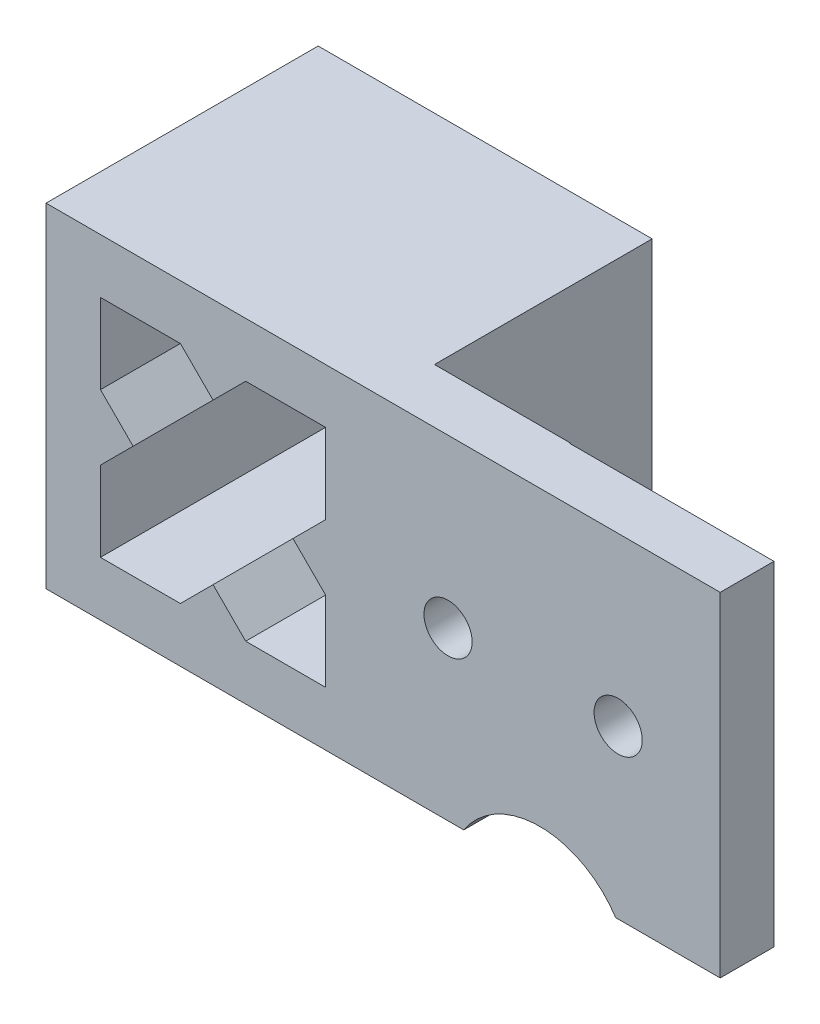
ISO-10303-21;
HEADER;
FILE_DESCRIPTION(('STEP AP214'),'2;1');
FILE_NAME('part.step','',(''),(''),'','','');
FILE_SCHEMA(('AUTOMOTIVE_DESIGN { 1 0 10303 214 1 1 1 1 }'));
ENDSEC;
DATA;
#1=APPLICATION_CONTEXT('core data for automotive mechanical design processes');
#2=APPLICATION_PROTOCOL_DEFINITION('international standard','automotive_design',2000,#1);
#3=PRODUCT_CONTEXT('',#1,'mechanical');
#4=PRODUCT('Part','Part','',(#3));
#5=PRODUCT_RELATED_PRODUCT_CATEGORY('part','',(#4));
#6=PRODUCT_DEFINITION_FORMATION('','',#4);
#7=PRODUCT_DEFINITION_CONTEXT('part definition',#1,'design');
#8=PRODUCT_DEFINITION('design','',#6,#7);
#9=PRODUCT_DEFINITION_SHAPE('','',#8);
#10=(LENGTH_UNIT() NAMED_UNIT(*) SI_UNIT(.MILLI.,.METRE.));
#11=(NAMED_UNIT(*) PLANE_ANGLE_UNIT() SI_UNIT($,.RADIAN.));
#12=(NAMED_UNIT(*) SI_UNIT($,.STERADIAN.) SOLID_ANGLE_UNIT());
#13=UNCERTAINTY_MEASURE_WITH_UNIT(LENGTH_MEASURE(1.E-05),#10,'distance_accuracy_value','');
#14=(GEOMETRIC_REPRESENTATION_CONTEXT(3) GLOBAL_UNCERTAINTY_ASSIGNED_CONTEXT((#13)) GLOBAL_UNIT_ASSIGNED_CONTEXT((#10,
#11,#12)) REPRESENTATION_CONTEXT('',''));
#15=CARTESIAN_POINT('',(0.,0.,0.));
#16=DIRECTION('',(0.,0.,1.));
#17=DIRECTION('',(1.,0.,0.));
#18=AXIS2_PLACEMENT_3D('',#15,#16,#17);
#19=CARTESIAN_POINT('',(28.2879999998215,0.,0.));
#20=DIRECTION('',(1.,0.,0.));
#21=DIRECTION('',(0.,0.,-1.));
#22=AXIS2_PLACEMENT_3D('',#19,#20,#21);
#23=PLANE('',#22);
#24=DIRECTION('',(0.,0.,1.));
#25=VECTOR('',#24,1.);
#26=CARTESIAN_POINT('',(28.2879999998215,15.5879999999047,0.));
#27=LINE('',#26,#25);
#28=CARTESIAN_POINT('',(28.2879999998215,15.5879999999047,20.32));
#29=VERTEX_POINT('',#28);
#30=CARTESIAN_POINT('',(28.2879999998215,15.5879999999047,20.381));
#31=VERTEX_POINT('',#30);
#32=EDGE_CURVE('E309',#29,#31,#27,.T.);
#33=ORIENTED_EDGE('',*,*,#32,.T.);
#34=DIRECTION('',(0.,-1.,0.));
#35=VECTOR('',#34,1.);
#36=CARTESIAN_POINT('',(28.2879999998215,0.,20.381));
#37=LINE('',#36,#35);
#38=CARTESIAN_POINT('',(28.2879999998215,10.381,20.381));
#39=VERTEX_POINT('',#38);
#40=EDGE_CURVE('E47',#31,#39,#37,.T.);
#41=ORIENTED_EDGE('',*,*,#40,.T.);
#42=DIRECTION('',(0.,0.,1.));
#43=VECTOR('',#42,1.);
#44=CARTESIAN_POINT('',(28.2879999998215,10.381,0.));
#45=LINE('',#44,#43);
#46=CARTESIAN_POINT('',(28.2879999998215,10.381,20.32));
#47=VERTEX_POINT('',#46);
#48=EDGE_CURVE('E306',#47,#39,#45,.T.);
#49=ORIENTED_EDGE('',*,*,#48,.F.);
#50=DIRECTION('',(0.,-1.,0.));
#51=VECTOR('',#50,1.);
#52=CARTESIAN_POINT('',(28.2879999998215,15.5879999999049,20.32));
#53=LINE('',#52,#51);
#54=EDGE_CURVE('E293',#29,#47,#53,.T.);
#55=ORIENTED_EDGE('',*,*,#54,.F.);
#56=EDGE_LOOP('',(#33,#41,#49,#55));
#57=FACE_BOUND('',#56,.T.);
#58=ADVANCED_FACE('F37',(#57),#23,.T.);
#59=DIRECTION('',(0.,0.,1.));
#60=VECTOR('',#59,1.);
#61=CARTESIAN_POINT('',(28.2879999998215,-10.381,0.));
#62=LINE('',#61,#60);
#63=CARTESIAN_POINT('',(28.2879999998215,-10.381,20.32));
#64=VERTEX_POINT('',#63);
#65=CARTESIAN_POINT('',(28.2879999998215,-10.381,20.381));
#66=VERTEX_POINT('',#65);
#67=EDGE_CURVE('E313',#64,#66,#62,.T.);
#68=ORIENTED_EDGE('',*,*,#67,.T.);
#69=CARTESIAN_POINT('',(28.2879999998215,-12.0431636581985,20.381));
#70=VERTEX_POINT('',#69);
#71=EDGE_CURVE('E11',#66,#70,#37,.T.);
#72=ORIENTED_EDGE('',*,*,#71,.T.);
#73=DIRECTION('',(0.,0.,1.));
#74=VECTOR('',#73,1.);
#75=CARTESIAN_POINT('',(28.2879999998215,-12.0431636581985,0.));
#76=LINE('',#75,#74);
#77=CARTESIAN_POINT('',(28.2879999998215,-12.0431636581985,20.32));
#78=VERTEX_POINT('',#77);
#79=EDGE_CURVE('E435',#78,#70,#76,.T.);
#80=ORIENTED_EDGE('',*,*,#79,.F.);
#81=EDGE_CURVE('E281',#64,#78,#53,.T.);
#82=ORIENTED_EDGE('',*,*,#81,.F.);
#83=EDGE_LOOP('',(#68,#72,#80,#82));
#84=FACE_BOUND('',#83,.T.);
#85=ADVANCED_FACE('F474',(#84),#23,.T.);
#86=CARTESIAN_POINT('',(0.,15.5879999999047,25.4));
#87=DIRECTION('',(0.,-1.,0.));
#88=DIRECTION('',(0.,0.,-1.));
#89=AXIS2_PLACEMENT_3D('',#86,#87,#88);
#90=PLANE('',#89);
#91=DIRECTION('',(0.,0.,1.));
#92=VECTOR('',#91,1.);
#93=CARTESIAN_POINT('',(15.5879999998215,15.5879999999047,0.));
#94=LINE('',#93,#92);
#95=CARTESIAN_POINT('',(15.5879999998215,15.5879999999047,0.));
#96=VERTEX_POINT('',#95);
#97=CARTESIAN_POINT('',(15.5879999998215,15.5879999999047,20.3199999999998));
#98=VERTEX_POINT('',#97);
#99=EDGE_CURVE('E278',#96,#98,#94,.T.);
#100=ORIENTED_EDGE('',*,*,#99,.F.);
#101=DIRECTION('',(-1.,0.,0.));
#102=VECTOR('',#101,1.);
#103=CARTESIAN_POINT('',(0.,15.5879999999047,0.));
#104=LINE('',#103,#102);
#105=CARTESIAN_POINT('',(-15.5879999999879,15.5879999999047,0.));
#106=VERTEX_POINT('',#105);
#107=EDGE_CURVE('E422',#96,#106,#104,.T.);
#108=ORIENTED_EDGE('',*,*,#107,.T.);
#109=DIRECTION('',(0.,0.,-1.));
#110=VECTOR('',#109,1.);
#111=CARTESIAN_POINT('',(-15.5879999999879,15.5879999999047,25.4));
#112=LINE('',#111,#110);
#113=CARTESIAN_POINT('',(-15.5879999999879,15.5879999999047,25.4));
#114=VERTEX_POINT('',#113);
#115=EDGE_CURVE('E431',#114,#106,#112,.T.);
#116=ORIENTED_EDGE('',*,*,#115,.F.);
#117=DIRECTION('',(-1.,0.,0.));
#118=VECTOR('',#117,1.);
#119=CARTESIAN_POINT('',(0.,15.5879999999047,25.4));
#120=LINE('',#119,#118);
#121=CARTESIAN_POINT('',(47.3379999998215,15.5879999999047,25.4));
#122=VERTEX_POINT('',#121);
#123=EDGE_CURVE('E369',#122,#114,#120,.T.);
#124=ORIENTED_EDGE('',*,*,#123,.F.);
#125=DIRECTION('',(0.,0.,1.));
#126=VECTOR('',#125,1.);
#127=CARTESIAN_POINT('',(47.3379999998215,15.5879999999047,-16.1545371657256));
#128=LINE('',#127,#126);
#129=CARTESIAN_POINT('',(47.3379999998215,15.5879999999047,20.381));
#130=VERTEX_POINT('',#129);
#131=EDGE_CURVE('E270',#130,#122,#128,.T.);
#132=ORIENTED_EDGE('',*,*,#131,.F.);
#133=DIRECTION('',(-1.,0.,0.));
#134=VECTOR('',#133,1.);
#135=CARTESIAN_POINT('',(0.,15.5879999999047,20.381));
#136=LINE('',#135,#134);
#137=EDGE_CURVE('E492',#130,#31,#136,.T.);
#138=ORIENTED_EDGE('',*,*,#137,.T.);
#139=ORIENTED_EDGE('',*,*,#32,.F.);
#140=DIRECTION('',(-1.,0.,0.));
#141=VECTOR('',#140,1.);
#142=CARTESIAN_POINT('',(0.,15.5879999999047,20.3199999999998));
#143=LINE('',#142,#141);
#144=EDGE_CURVE('E61',#29,#98,#143,.T.);
#145=ORIENTED_EDGE('',*,*,#144,.T.);
#146=EDGE_LOOP('',(#100,#108,#116,#124,#132,#138,#139,#145));
#147=FACE_BOUND('',#146,.T.);
#148=ADVANCED_FACE('F498',(#147),#90,.F.);
#149=CARTESIAN_POINT('',(0.,-15.5879999999047,25.4));
#150=DIRECTION('',(0.,-1.,0.));
#151=DIRECTION('',(1.,0.,0.));
#152=AXIS2_PLACEMENT_3D('',#149,#150,#151);
#153=PLANE('',#152);
#154=DIRECTION('',(-1.,0.,0.));
#155=VECTOR('',#154,1.);
#156=CARTESIAN_POINT('',(0.,-15.5879999999047,0.));
#157=LINE('',#156,#155);
#158=CARTESIAN_POINT('',(15.5879999998215,-15.5879999999047,0.));
#159=VERTEX_POINT('',#158);
#160=CARTESIAN_POINT('',(-15.5879999999879,-15.5879999999047,0.));
#161=VERTEX_POINT('',#160);
#162=EDGE_CURVE('E332',#159,#161,#157,.T.);
#163=ORIENTED_EDGE('',*,*,#162,.F.);
#164=DIRECTION('',(0.,0.,1.));
#165=VECTOR('',#164,1.);
#166=CARTESIAN_POINT('',(15.5879999998215,-15.5879999999047,0.));
#167=LINE('',#166,#165);
#168=CARTESIAN_POINT('',(15.5879999998215,-15.5879999999047,20.3199999999998));
#169=VERTEX_POINT('',#168);
#170=EDGE_CURVE('E279',#159,#169,#167,.T.);
#171=ORIENTED_EDGE('',*,*,#170,.T.);
#172=DIRECTION('',(-1.,0.,0.));
#173=VECTOR('',#172,1.);
#174=CARTESIAN_POINT('',(0.,-15.5879999999047,20.3199999999998));
#175=LINE('',#174,#173);
#176=CARTESIAN_POINT('',(23.4023260560087,-15.5879999999047,20.3199999999998));
#177=VERTEX_POINT('',#176);
#178=EDGE_CURVE('E282',#177,#169,#175,.T.);
#179=ORIENTED_EDGE('',*,*,#178,.F.);
#180=DIRECTION('',(0.,0.,1.));
#181=VECTOR('',#180,1.);
#182=CARTESIAN_POINT('',(23.4023260560087,-15.5879999999047,0.));
#183=LINE('',#182,#181);
#184=CARTESIAN_POINT('',(23.4023260560087,-15.5879999999047,25.4));
#185=VERTEX_POINT('',#184);
#186=EDGE_CURVE('E248',#185,#177,#183,.F.);
#187=ORIENTED_EDGE('',*,*,#186,.F.);
#188=DIRECTION('',(-1.,0.,0.));
#189=VECTOR('',#188,1.);
#190=CARTESIAN_POINT('',(0.,-15.5879999999047,25.4));
#191=LINE('',#190,#189);
#192=CARTESIAN_POINT('',(-15.5879999999879,-15.5879999999047,25.4));
#193=VERTEX_POINT('',#192);
#194=EDGE_CURVE('E244',#185,#193,#191,.T.);
#195=ORIENTED_EDGE('',*,*,#194,.T.);
#196=DIRECTION('',(0.,0.,-1.));
#197=VECTOR('',#196,1.);
#198=CARTESIAN_POINT('',(-15.5879999999879,-15.5879999999047,25.4));
#199=LINE('',#198,#197);
#200=EDGE_CURVE('E428',#193,#161,#199,.T.);
#201=ORIENTED_EDGE('',*,*,#200,.T.);
#202=EDGE_LOOP('',(#163,#171,#179,#187,#195,#201));
#203=FACE_BOUND('',#202,.T.);
#204=ADVANCED_FACE('F609',(#203),#153,.T.);
#205=CARTESIAN_POINT('',(0.,0.,0.));
#206=DIRECTION('',(0.,0.,1.));
#207=DIRECTION('',(1.,0.,0.));
#208=AXIS2_PLACEMENT_3D('',#205,#206,#207);
#209=PLANE('',#208);
#210=DIRECTION('',(0.707106781186555,-0.70710678118654,0.));
#211=VECTOR('',#210,1.);
#212=CARTESIAN_POINT('',(-3.72999999994653,-3.72999999994662,0.));
#213=LINE('',#212,#211);
#214=CARTESIAN_POINT('',(1.16573417585641E-11,-7.4599999999047,0.));
#215=VERTEX_POINT('',#214);
#216=CARTESIAN_POINT('',(3.0480000000117,-10.5079999999047,0.));
#217=VERTEX_POINT('',#216);
#218=EDGE_CURVE('E327',#215,#217,#213,.T.);
#219=ORIENTED_EDGE('',*,*,#218,.T.);
#220=DIRECTION('',(-1.,0.,0.));
#221=VECTOR('',#220,1.);
#222=CARTESIAN_POINT('',(0.,-10.5079999999047,0.));
#223=LINE('',#222,#221);
#224=CARTESIAN_POINT('',(10.5079999998215,-10.5079999999047,0.));
#225=VERTEX_POINT('',#224);
#226=EDGE_CURVE('E417',#225,#217,#223,.T.);
#227=ORIENTED_EDGE('',*,*,#226,.F.);
#228=DIRECTION('',(0.,-1.,0.));
#229=VECTOR('',#228,1.);
#230=CARTESIAN_POINT('',(10.5079999998215,0.,0.));
#231=LINE('',#230,#229);
#232=CARTESIAN_POINT('',(10.5079999998215,-3.04799999990522,0.));
#233=VERTEX_POINT('',#232);
#234=EDGE_CURVE('E415',#233,#225,#231,.T.);
#235=ORIENTED_EDGE('',*,*,#234,.F.);
#236=DIRECTION('',(0.707106781186548,-0.707106781186547,0.));
#237=VECTOR('',#236,1.);
#238=CARTESIAN_POINT('',(3.72999999995819,3.72999999995819,0.));
#239=LINE('',#238,#237);
#240=CARTESIAN_POINT('',(7.45999999982147,9.4911925541119E-11,0.));
#241=VERTEX_POINT('',#240);
#242=EDGE_CURVE('E413',#241,#233,#239,.T.);
#243=ORIENTED_EDGE('',*,*,#242,.F.);
#244=DIRECTION('',(0.707106781186551,0.707106781186544,0.));
#245=VECTOR('',#244,1.);
#246=CARTESIAN_POINT('',(3.72999999986321,-3.72999999986325,0.));
#247=LINE('',#246,#245);
#248=CARTESIAN_POINT('',(10.5079999998215,3.04800000009494,0.));
#249=VERTEX_POINT('',#248);
#250=EDGE_CURVE('E410',#241,#249,#247,.T.);
#251=ORIENTED_EDGE('',*,*,#250,.T.);
#252=DIRECTION('',(0.,-1.,0.));
#253=VECTOR('',#252,1.);
#254=CARTESIAN_POINT('',(10.5079999998215,0.,0.));
#255=LINE('',#254,#253);
#256=CARTESIAN_POINT('',(10.5079999998215,10.5079999999047,0.));
#257=VERTEX_POINT('',#256);
#258=EDGE_CURVE('E407',#257,#249,#255,.T.);
#259=ORIENTED_EDGE('',*,*,#258,.F.);
#260=DIRECTION('',(-1.,0.,0.));
#261=VECTOR('',#260,1.);
#262=CARTESIAN_POINT('',(0.,10.5079999999047,0.));
#263=LINE('',#262,#261);
#264=CARTESIAN_POINT('',(3.04799999982183,10.5079999999047,0.));
#265=VERTEX_POINT('',#264);
#266=EDGE_CURVE('E404',#257,#265,#263,.T.);
#267=ORIENTED_EDGE('',*,*,#266,.T.);
#268=DIRECTION('',(0.707106781186547,0.707106781186548,0.));
#269=VECTOR('',#268,1.);
#270=CARTESIAN_POINT('',(-3.73000000004143,3.73000000004143,0.));
#271=LINE('',#270,#269);
#272=CARTESIAN_POINT('',(-1.78133115896761E-10,7.45999999990473,0.));
#273=VERTEX_POINT('',#272);
#274=EDGE_CURVE('E401',#273,#265,#271,.T.);
#275=ORIENTED_EDGE('',*,*,#274,.F.);
#276=DIRECTION('',(-0.707106781186547,0.707106781186548,0.));
#277=VECTOR('',#276,1.);
#278=CARTESIAN_POINT('',(3.72999999986328,3.72999999986327,0.));
#279=LINE('',#278,#277);
#280=CARTESIAN_POINT('',(-3.04800000017812,10.5079999999047,0.));
#281=VERTEX_POINT('',#280);
#282=EDGE_CURVE('E398',#273,#281,#279,.T.);
#283=ORIENTED_EDGE('',*,*,#282,.T.);
#284=DIRECTION('',(-1.,0.,0.));
#285=VECTOR('',#284,1.);
#286=CARTESIAN_POINT('',(0.,10.5079999999047,0.));
#287=LINE('',#286,#285);
#288=CARTESIAN_POINT('',(-10.5079999999879,10.5079999999047,0.));
#289=VERTEX_POINT('',#288);
#290=EDGE_CURVE('E395',#281,#289,#287,.T.);
#291=ORIENTED_EDGE('',*,*,#290,.T.);
#292=DIRECTION('',(0.,-1.,0.));
#293=VECTOR('',#292,1.);
#294=CARTESIAN_POINT('',(-10.5079999999879,0.,0.));
#295=LINE('',#294,#293);
#296=CARTESIAN_POINT('',(-10.5079999999879,3.04799999990508,0.));
#297=VERTEX_POINT('',#296);
#298=EDGE_CURVE('E392',#289,#297,#295,.T.);
#299=ORIENTED_EDGE('',*,*,#298,.T.);
#300=DIRECTION('',(-0.707106781186548,0.707106781186547,0.));
#301=VECTOR('',#300,1.);
#302=CARTESIAN_POINT('',(-3.73000000004141,-3.73000000004141,0.));
#303=LINE('',#302,#301);
#304=CARTESIAN_POINT('',(-7.45999999998795,-9.48780984333375E-11,0.));
#305=VERTEX_POINT('',#304);
#306=EDGE_CURVE('E389',#305,#297,#303,.T.);
#307=ORIENTED_EDGE('',*,*,#306,.F.);
#308=DIRECTION('',(-0.707106781186551,-0.707106781186544,0.));
#309=VECTOR('',#308,1.);
#310=CARTESIAN_POINT('',(-3.72999999994647,3.72999999994651,0.));
#311=LINE('',#310,#309);
#312=CARTESIAN_POINT('',(-10.5079999999879,-3.04800000009486,0.));
#313=VERTEX_POINT('',#312);
#314=EDGE_CURVE('E386',#305,#313,#311,.T.);
#315=ORIENTED_EDGE('',*,*,#314,.T.);
#316=DIRECTION('',(0.,-1.,0.));
#317=VECTOR('',#316,1.);
#318=CARTESIAN_POINT('',(-10.5079999999879,0.,0.));
#319=LINE('',#318,#317);
#320=CARTESIAN_POINT('',(-10.5079999999879,-10.5079999999047,0.));
#321=VERTEX_POINT('',#320);
#322=EDGE_CURVE('E383',#313,#321,#319,.T.);
#323=ORIENTED_EDGE('',*,*,#322,.T.);
#324=DIRECTION('',(-1.,0.,0.));
#325=VECTOR('',#324,1.);
#326=CARTESIAN_POINT('',(0.,-10.5079999999047,0.));
#327=LINE('',#326,#325);
#328=CARTESIAN_POINT('',(-3.04799999998829,-10.5079999999047,0.));
#329=VERTEX_POINT('',#328);
#330=EDGE_CURVE('E380',#329,#321,#327,.T.);
#331=ORIENTED_EDGE('',*,*,#330,.F.);
#332=DIRECTION('',(-0.707106781186541,-0.707106781186554,0.));
#333=VECTOR('',#332,1.);
#334=CARTESIAN_POINT('',(3.72999999995818,-3.72999999995811,0.));
#335=LINE('',#334,#333);
#336=EDGE_CURVE('E378',#215,#329,#335,.T.);
#337=ORIENTED_EDGE('',*,*,#336,.F.);
#338=EDGE_LOOP('',(#219,#227,#235,#243,#251,#259,#267,#275,#283,#291,#299,#307,#315,#323,#331,#337));
#339=FACE_BOUND('',#338,.T.);
#340=DIRECTION('',(0.,-1.,0.));
#341=VECTOR('',#340,1.);
#342=CARTESIAN_POINT('',(15.5879999998215,0.,0.));
#343=LINE('',#342,#341);
#344=EDGE_CURVE('E420',#96,#159,#343,.T.);
#345=ORIENTED_EDGE('',*,*,#344,.T.);
#346=ORIENTED_EDGE('',*,*,#162,.T.);
#347=DIRECTION('',(0.,-1.,0.));
#348=VECTOR('',#347,1.);
#349=CARTESIAN_POINT('',(-15.5879999999879,0.,0.));
#350=LINE('',#349,#348);
#351=EDGE_CURVE('E424',#106,#161,#350,.T.);
#352=ORIENTED_EDGE('',*,*,#351,.F.);
#353=ORIENTED_EDGE('',*,*,#107,.F.);
#354=EDGE_LOOP('',(#345,#346,#352,#353));
#355=FACE_BOUND('',#354,.T.);
#356=ADVANCED_FACE('F506',(#339,#355),#209,.F.);
#357=CARTESIAN_POINT('',(15.5879999998215,0.,25.4));
#358=DIRECTION('',(1.,0.,0.));
#359=DIRECTION('',(0.,0.,-1.));
#360=AXIS2_PLACEMENT_3D('',#357,#358,#359);
#361=PLANE('',#360);
#362=DIRECTION('',(0.,0.,1.));
#363=VECTOR('',#362,1.);
#364=CARTESIAN_POINT('',(15.5879999998215,-10.381,0.));
#365=LINE('',#364,#363);
#366=CARTESIAN_POINT('',(15.5879999998215,-10.381,20.3199999999998));
#367=VERTEX_POINT('',#366);
#368=CARTESIAN_POINT('',(15.5879999998215,-10.381,20.381));
#369=VERTEX_POINT('',#368);
#370=EDGE_CURVE('E318',#367,#369,#365,.T.);
#371=ORIENTED_EDGE('',*,*,#370,.F.);
#372=DIRECTION('',(0.,-1.,0.));
#373=VECTOR('',#372,1.);
#374=CARTESIAN_POINT('',(15.5879999998215,15.5879999999047,20.3199999999998));
#375=LINE('',#374,#373);
#376=EDGE_CURVE('E292',#367,#169,#375,.T.);
#377=ORIENTED_EDGE('',*,*,#376,.T.);
#378=ORIENTED_EDGE('',*,*,#170,.F.);
#379=ORIENTED_EDGE('',*,*,#344,.F.);
#380=ORIENTED_EDGE('',*,*,#99,.T.);
#381=CARTESIAN_POINT('',(15.5879999998215,10.381,20.3199999999998));
#382=VERTEX_POINT('',#381);
#383=EDGE_CURVE('E288',#98,#382,#375,.T.);
#384=ORIENTED_EDGE('',*,*,#383,.T.);
#385=DIRECTION('',(0.,0.,1.));
#386=VECTOR('',#385,1.);
#387=CARTESIAN_POINT('',(15.5879999998215,10.381,0.));
#388=LINE('',#387,#386);
#389=CARTESIAN_POINT('',(15.5879999998215,10.381,20.381));
#390=VERTEX_POINT('',#389);
#391=EDGE_CURVE('E305',#382,#390,#388,.T.);
#392=ORIENTED_EDGE('',*,*,#391,.T.);
#393=DIRECTION('',(0.,1.,0.));
#394=VECTOR('',#393,1.);
#395=CARTESIAN_POINT('',(15.5879999998215,0.,20.381));
#396=LINE('',#395,#394);
#397=EDGE_CURVE('E310',#369,#390,#396,.T.);
#398=ORIENTED_EDGE('',*,*,#397,.F.);
#399=EDGE_LOOP('',(#371,#377,#378,#379,#380,#384,#392,#398));
#400=FACE_BOUND('',#399,.T.);
#401=ADVANCED_FACE('F485',(#400),#361,.T.);
#402=CARTESIAN_POINT('',(-15.5879999999879,0.,25.4));
#403=DIRECTION('',(1.,0.,0.));
#404=DIRECTION('',(0.,1.,0.));
#405=AXIS2_PLACEMENT_3D('',#402,#403,#404);
#406=PLANE('',#405);
#407=ORIENTED_EDGE('',*,*,#351,.T.);
#408=ORIENTED_EDGE('',*,*,#200,.F.);
#409=DIRECTION('',(0.,-1.,0.));
#410=VECTOR('',#409,1.);
#411=CARTESIAN_POINT('',(-15.5879999999879,0.,25.4));
#412=LINE('',#411,#410);
#413=EDGE_CURVE('E372',#114,#193,#412,.T.);
#414=ORIENTED_EDGE('',*,*,#413,.F.);
#415=ORIENTED_EDGE('',*,*,#115,.T.);
#416=EDGE_LOOP('',(#407,#408,#414,#415));
#417=FACE_BOUND('',#416,.T.);
#418=ADVANCED_FACE('F511',(#417),#406,.F.);
#419=CARTESIAN_POINT('',(-3.72999999994653,-3.72999999994662,25.4));
#420=DIRECTION('',(0.70710678118654,0.707106781186555,0.));
#421=DIRECTION('',(-0.707106781186555,0.70710678118654,0.));
#422=AXIS2_PLACEMENT_3D('',#419,#420,#421);
#423=PLANE('',#422);
#424=ORIENTED_EDGE('',*,*,#218,.F.);
#425=DIRECTION('',(0.,0.,-1.));
#426=VECTOR('',#425,1.);
#427=CARTESIAN_POINT('',(1.16573417585641E-11,-7.4599999999047,25.4));
#428=LINE('',#427,#426);
#429=CARTESIAN_POINT('',(1.16573417585641E-11,-7.4599999999047,25.4));
#430=VERTEX_POINT('',#429);
#431=EDGE_CURVE('E432',#430,#215,#428,.T.);
#432=ORIENTED_EDGE('',*,*,#431,.F.);
#433=DIRECTION('',(0.707106781186555,-0.70710678118654,0.));
#434=VECTOR('',#433,1.);
#435=CARTESIAN_POINT('',(-3.72999999994653,-3.72999999994662,25.4));
#436=LINE('',#435,#434);
#437=CARTESIAN_POINT('',(3.0480000000117,-10.5079999999047,25.4));
#438=VERTEX_POINT('',#437);
#439=EDGE_CURVE('E328',#430,#438,#436,.T.);
#440=ORIENTED_EDGE('',*,*,#439,.T.);
#441=DIRECTION('',(0.,0.,-1.));
#442=VECTOR('',#441,1.);
#443=CARTESIAN_POINT('',(3.0480000000117,-10.5079999999047,25.4));
#444=LINE('',#443,#442);
#445=EDGE_CURVE('E375',#438,#217,#444,.T.);
#446=ORIENTED_EDGE('',*,*,#445,.T.);
#447=EDGE_LOOP('',(#424,#432,#440,#446));
#448=FACE_BOUND('',#447,.T.);
#449=ADVANCED_FACE('F39',(#448),#423,.T.);
#450=CARTESIAN_POINT('',(3.72999999995818,-3.72999999995811,25.4));
#451=DIRECTION('',(0.707106781186554,-0.707106781186541,0.));
#452=DIRECTION('',(0.707106781186541,0.707106781186554,0.));
#453=AXIS2_PLACEMENT_3D('',#450,#451,#452);
#454=PLANE('',#453);
#455=ORIENTED_EDGE('',*,*,#336,.T.);
#456=DIRECTION('',(0.,0.,-1.));
#457=VECTOR('',#456,1.);
#458=CARTESIAN_POINT('',(-3.04799999998829,-10.5079999999047,25.4));
#459=LINE('',#458,#457);
#460=CARTESIAN_POINT('',(-3.04799999998829,-10.5079999999047,25.4));
#461=VERTEX_POINT('',#460);
#462=EDGE_CURVE('E465',#461,#329,#459,.T.);
#463=ORIENTED_EDGE('',*,*,#462,.F.);
#464=DIRECTION('',(-0.707106781186541,-0.707106781186554,0.));
#465=VECTOR('',#464,1.);
#466=CARTESIAN_POINT('',(3.72999999995818,-3.72999999995811,25.4));
#467=LINE('',#466,#465);
#468=EDGE_CURVE('E331',#430,#461,#467,.T.);
#469=ORIENTED_EDGE('',*,*,#468,.F.);
#470=ORIENTED_EDGE('',*,*,#431,.T.);
#471=EDGE_LOOP('',(#455,#463,#469,#470));
#472=FACE_BOUND('',#471,.T.);
#473=ADVANCED_FACE('F843',(#472),#454,.F.);
#474=CARTESIAN_POINT('',(0.,-10.5079999999047,25.4));
#475=DIRECTION('',(0.,-1.,0.));
#476=DIRECTION('',(0.,0.,-1.));
#477=AXIS2_PLACEMENT_3D('',#474,#475,#476);
#478=PLANE('',#477);
#479=ORIENTED_EDGE('',*,*,#330,.T.);
#480=DIRECTION('',(0.,0.,-1.));
#481=VECTOR('',#480,1.);
#482=CARTESIAN_POINT('',(-10.5079999999879,-10.5079999999047,25.4));
#483=LINE('',#482,#481);
#484=CARTESIAN_POINT('',(-10.5079999999879,-10.5079999999047,25.4));
#485=VERTEX_POINT('',#484);
#486=EDGE_CURVE('E463',#485,#321,#483,.T.);
#487=ORIENTED_EDGE('',*,*,#486,.F.);
#488=DIRECTION('',(-1.,0.,0.));
#489=VECTOR('',#488,1.);
#490=CARTESIAN_POINT('',(0.,-10.5079999999047,25.4));
#491=LINE('',#490,#489);
#492=EDGE_CURVE('E334',#461,#485,#491,.T.);
#493=ORIENTED_EDGE('',*,*,#492,.F.);
#494=ORIENTED_EDGE('',*,*,#462,.T.);
#495=EDGE_LOOP('',(#479,#487,#493,#494));
#496=FACE_BOUND('',#495,.T.);
#497=ADVANCED_FACE('F833',(#496),#478,.F.);
#498=CARTESIAN_POINT('',(-10.5079999999879,0.,25.4));
#499=DIRECTION('',(1.,0.,0.));
#500=DIRECTION('',(0.,1.,0.));
#501=AXIS2_PLACEMENT_3D('',#498,#499,#500);
#502=PLANE('',#501);
#503=ORIENTED_EDGE('',*,*,#322,.F.);
#504=DIRECTION('',(0.,0.,-1.));
#505=VECTOR('',#504,1.);
#506=CARTESIAN_POINT('',(-10.5079999999879,-3.04800000009486,25.4));
#507=LINE('',#506,#505);
#508=CARTESIAN_POINT('',(-10.5079999999879,-3.04800000009486,25.4));
#509=VERTEX_POINT('',#508);
#510=EDGE_CURVE('E461',#509,#313,#507,.T.);
#511=ORIENTED_EDGE('',*,*,#510,.F.);
#512=DIRECTION('',(0.,-1.,0.));
#513=VECTOR('',#512,1.);
#514=CARTESIAN_POINT('',(-10.5079999999879,0.,25.4));
#515=LINE('',#514,#513);
#516=EDGE_CURVE('E336',#509,#485,#515,.T.);
#517=ORIENTED_EDGE('',*,*,#516,.T.);
#518=ORIENTED_EDGE('',*,*,#486,.T.);
#519=EDGE_LOOP('',(#503,#511,#517,#518));
#520=FACE_BOUND('',#519,.T.);
#521=ADVANCED_FACE('F822',(#520),#502,.T.);
#522=CARTESIAN_POINT('',(-3.72999999994647,3.72999999994651,25.4));
#523=DIRECTION('',(0.707106781186544,-0.707106781186551,0.));
#524=DIRECTION('',(0.707106781186551,0.707106781186544,0.));
#525=AXIS2_PLACEMENT_3D('',#522,#523,#524);
#526=PLANE('',#525);
#527=ORIENTED_EDGE('',*,*,#314,.F.);
#528=DIRECTION('',(0.,0.,-1.));
#529=VECTOR('',#528,1.);
#530=CARTESIAN_POINT('',(-7.45999999998795,-9.48780984333375E-11,25.4));
#531=LINE('',#530,#529);
#532=CARTESIAN_POINT('',(-7.45999999998795,-9.48780984333375E-11,25.4));
#533=VERTEX_POINT('',#532);
#534=EDGE_CURVE('E459',#533,#305,#531,.T.);
#535=ORIENTED_EDGE('',*,*,#534,.F.);
#536=DIRECTION('',(-0.707106781186551,-0.707106781186544,0.));
#537=VECTOR('',#536,1.);
#538=CARTESIAN_POINT('',(-3.72999999994647,3.72999999994651,25.4));
#539=LINE('',#538,#537);
#540=EDGE_CURVE('E339',#533,#509,#539,.T.);
#541=ORIENTED_EDGE('',*,*,#540,.T.);
#542=ORIENTED_EDGE('',*,*,#510,.T.);
#543=EDGE_LOOP('',(#527,#535,#541,#542));
#544=FACE_BOUND('',#543,.T.);
#545=ADVANCED_FACE('F811',(#544),#526,.T.);
#546=CARTESIAN_POINT('',(-3.73000000004141,-3.73000000004141,25.4));
#547=DIRECTION('',(-0.707106781186547,-0.707106781186548,0.));
#548=DIRECTION('',(0.707106781186548,-0.707106781186547,0.));
#549=AXIS2_PLACEMENT_3D('',#546,#547,#548);
#550=PLANE('',#549);
#551=ORIENTED_EDGE('',*,*,#306,.T.);
#552=DIRECTION('',(0.,0.,-1.));
#553=VECTOR('',#552,1.);
#554=CARTESIAN_POINT('',(-10.5079999999879,3.04799999990508,25.4));
#555=LINE('',#554,#553);
#556=CARTESIAN_POINT('',(-10.5079999999879,3.04799999990508,25.4));
#557=VERTEX_POINT('',#556);
#558=EDGE_CURVE('E457',#557,#297,#555,.T.);
#559=ORIENTED_EDGE('',*,*,#558,.F.);
#560=DIRECTION('',(-0.707106781186548,0.707106781186547,0.));
#561=VECTOR('',#560,1.);
#562=CARTESIAN_POINT('',(-3.73000000004141,-3.73000000004141,25.4));
#563=LINE('',#562,#561);
#564=EDGE_CURVE('E342',#533,#557,#563,.T.);
#565=ORIENTED_EDGE('',*,*,#564,.F.);
#566=ORIENTED_EDGE('',*,*,#534,.T.);
#567=EDGE_LOOP('',(#551,#559,#565,#566));
#568=FACE_BOUND('',#567,.T.);
#569=ADVANCED_FACE('F801',(#568),#550,.F.);
#570=CARTESIAN_POINT('',(-10.5079999999879,0.,25.4));
#571=DIRECTION('',(1.,0.,0.));
#572=DIRECTION('',(0.,1.,0.));
#573=AXIS2_PLACEMENT_3D('',#570,#571,#572);
#574=PLANE('',#573);
#575=ORIENTED_EDGE('',*,*,#298,.F.);
#576=DIRECTION('',(0.,0.,-1.));
#577=VECTOR('',#576,1.);
#578=CARTESIAN_POINT('',(-10.5079999999879,10.5079999999047,25.4));
#579=LINE('',#578,#577);
#580=CARTESIAN_POINT('',(-10.5079999999879,10.5079999999047,25.4));
#581=VERTEX_POINT('',#580);
#582=EDGE_CURVE('E455',#581,#289,#579,.T.);
#583=ORIENTED_EDGE('',*,*,#582,.F.);
#584=DIRECTION('',(0.,-1.,0.));
#585=VECTOR('',#584,1.);
#586=CARTESIAN_POINT('',(-10.5079999999879,0.,25.4));
#587=LINE('',#586,#585);
#588=EDGE_CURVE('E344',#581,#557,#587,.T.);
#589=ORIENTED_EDGE('',*,*,#588,.T.);
#590=ORIENTED_EDGE('',*,*,#558,.T.);
#591=EDGE_LOOP('',(#575,#583,#589,#590));
#592=FACE_BOUND('',#591,.T.);
#593=ADVANCED_FACE('F791',(#592),#574,.T.);
#594=CARTESIAN_POINT('',(0.,10.5079999999047,25.4));
#595=DIRECTION('',(0.,-1.,0.));
#596=DIRECTION('',(1.,0.,0.));
#597=AXIS2_PLACEMENT_3D('',#594,#595,#596);
#598=PLANE('',#597);
#599=ORIENTED_EDGE('',*,*,#290,.F.);
#600=DIRECTION('',(0.,0.,-1.));
#601=VECTOR('',#600,1.);
#602=CARTESIAN_POINT('',(-3.04800000017812,10.5079999999047,25.4));
#603=LINE('',#602,#601);
#604=CARTESIAN_POINT('',(-3.04800000017812,10.5079999999047,25.4));
#605=VERTEX_POINT('',#604);
#606=EDGE_CURVE('E453',#605,#281,#603,.T.);
#607=ORIENTED_EDGE('',*,*,#606,.F.);
#608=DIRECTION('',(-1.,0.,0.));
#609=VECTOR('',#608,1.);
#610=CARTESIAN_POINT('',(0.,10.5079999999047,25.4));
#611=LINE('',#610,#609);
#612=EDGE_CURVE('E347',#605,#581,#611,.T.);
#613=ORIENTED_EDGE('',*,*,#612,.T.);
#614=ORIENTED_EDGE('',*,*,#582,.T.);
#615=EDGE_LOOP('',(#599,#607,#613,#614));
#616=FACE_BOUND('',#615,.T.);
#617=ADVANCED_FACE('F780',(#616),#598,.T.);
#618=CARTESIAN_POINT('',(3.72999999986328,3.72999999986327,25.4));
#619=DIRECTION('',(-0.707106781186548,-0.707106781186547,0.));
#620=DIRECTION('',(0.707106781186547,-0.707106781186548,0.));
#621=AXIS2_PLACEMENT_3D('',#618,#619,#620);
#622=PLANE('',#621);
#623=ORIENTED_EDGE('',*,*,#282,.F.);
#624=DIRECTION('',(0.,0.,-1.));
#625=VECTOR('',#624,1.);
#626=CARTESIAN_POINT('',(-1.78133115896761E-10,7.45999999990473,25.4));
#627=LINE('',#626,#625);
#628=CARTESIAN_POINT('',(-1.78133115896761E-10,7.45999999990473,25.4));
#629=VERTEX_POINT('',#628);
#630=EDGE_CURVE('E451',#629,#273,#627,.T.);
#631=ORIENTED_EDGE('',*,*,#630,.F.);
#632=DIRECTION('',(-0.707106781186547,0.707106781186548,0.));
#633=VECTOR('',#632,1.);
#634=CARTESIAN_POINT('',(3.72999999986328,3.72999999986327,25.4));
#635=LINE('',#634,#633);
#636=EDGE_CURVE('E350',#629,#605,#635,.T.);
#637=ORIENTED_EDGE('',*,*,#636,.T.);
#638=ORIENTED_EDGE('',*,*,#606,.T.);
#639=EDGE_LOOP('',(#623,#631,#637,#638));
#640=FACE_BOUND('',#639,.T.);
#641=ADVANCED_FACE('F769',(#640),#622,.T.);
#642=CARTESIAN_POINT('',(-3.73000000004143,3.73000000004143,25.4));
#643=DIRECTION('',(-0.707106781186548,0.707106781186547,0.));
#644=DIRECTION('',(-0.707106781186547,-0.707106781186548,0.));
#645=AXIS2_PLACEMENT_3D('',#642,#643,#644);
#646=PLANE('',#645);
#647=ORIENTED_EDGE('',*,*,#274,.T.);
#648=DIRECTION('',(0.,0.,-1.));
#649=VECTOR('',#648,1.);
#650=CARTESIAN_POINT('',(3.04799999982183,10.5079999999047,25.4));
#651=LINE('',#650,#649);
#652=CARTESIAN_POINT('',(3.04799999982183,10.5079999999047,25.4));
#653=VERTEX_POINT('',#652);
#654=EDGE_CURVE('E449',#653,#265,#651,.T.);
#655=ORIENTED_EDGE('',*,*,#654,.F.);
#656=DIRECTION('',(0.707106781186547,0.707106781186548,0.));
#657=VECTOR('',#656,1.);
#658=CARTESIAN_POINT('',(-3.73000000004143,3.73000000004143,25.4));
#659=LINE('',#658,#657);
#660=EDGE_CURVE('E353',#629,#653,#659,.T.);
#661=ORIENTED_EDGE('',*,*,#660,.F.);
#662=ORIENTED_EDGE('',*,*,#630,.T.);
#663=EDGE_LOOP('',(#647,#655,#661,#662));
#664=FACE_BOUND('',#663,.T.);
#665=ADVANCED_FACE('F759',(#664),#646,.F.);
#666=CARTESIAN_POINT('',(0.,10.5079999999047,25.4));
#667=DIRECTION('',(0.,-1.,0.));
#668=DIRECTION('',(1.,0.,0.));
#669=AXIS2_PLACEMENT_3D('',#666,#667,#668);
#670=PLANE('',#669);
#671=ORIENTED_EDGE('',*,*,#266,.F.);
#672=DIRECTION('',(0.,0.,-1.));
#673=VECTOR('',#672,1.);
#674=CARTESIAN_POINT('',(10.5079999998215,10.5079999999047,25.4));
#675=LINE('',#674,#673);
#676=CARTESIAN_POINT('',(10.5079999998215,10.5079999999047,25.4));
#677=VERTEX_POINT('',#676);
#678=EDGE_CURVE('E447',#677,#257,#675,.T.);
#679=ORIENTED_EDGE('',*,*,#678,.F.);
#680=DIRECTION('',(-1.,0.,0.));
#681=VECTOR('',#680,1.);
#682=CARTESIAN_POINT('',(0.,10.5079999999047,25.4));
#683=LINE('',#682,#681);
#684=EDGE_CURVE('E355',#677,#653,#683,.T.);
#685=ORIENTED_EDGE('',*,*,#684,.T.);
#686=ORIENTED_EDGE('',*,*,#654,.T.);
#687=EDGE_LOOP('',(#671,#679,#685,#686));
#688=FACE_BOUND('',#687,.T.);
#689=ADVANCED_FACE('F749',(#688),#670,.T.);
#690=CARTESIAN_POINT('',(10.5079999998215,0.,25.4));
#691=DIRECTION('',(1.,0.,0.));
#692=DIRECTION('',(0.,1.,0.));
#693=AXIS2_PLACEMENT_3D('',#690,#691,#692);
#694=PLANE('',#693);
#695=ORIENTED_EDGE('',*,*,#258,.T.);
#696=DIRECTION('',(0.,0.,-1.));
#697=VECTOR('',#696,1.);
#698=CARTESIAN_POINT('',(10.5079999998215,3.04800000009494,25.4));
#699=LINE('',#698,#697);
#700=CARTESIAN_POINT('',(10.5079999998215,3.04800000009494,25.4));
#701=VERTEX_POINT('',#700);
#702=EDGE_CURVE('E445',#701,#249,#699,.T.);
#703=ORIENTED_EDGE('',*,*,#702,.F.);
#704=DIRECTION('',(0.,-1.,0.));
#705=VECTOR('',#704,1.);
#706=CARTESIAN_POINT('',(10.5079999998215,0.,25.4));
#707=LINE('',#706,#705);
#708=EDGE_CURVE('E358',#677,#701,#707,.T.);
#709=ORIENTED_EDGE('',*,*,#708,.F.);
#710=ORIENTED_EDGE('',*,*,#678,.T.);
#711=EDGE_LOOP('',(#695,#703,#709,#710));
#712=FACE_BOUND('',#711,.T.);
#713=ADVANCED_FACE('F738',(#712),#694,.F.);
#714=CARTESIAN_POINT('',(3.72999999986321,-3.72999999986325,25.4));
#715=DIRECTION('',(-0.707106781186544,0.707106781186551,0.));
#716=DIRECTION('',(-0.707106781186551,-0.707106781186544,0.));
#717=AXIS2_PLACEMENT_3D('',#714,#715,#716);
#718=PLANE('',#717);
#719=ORIENTED_EDGE('',*,*,#250,.F.);
#720=DIRECTION('',(0.,0.,-1.));
#721=VECTOR('',#720,1.);
#722=CARTESIAN_POINT('',(7.45999999982147,9.4911925541119E-11,25.4));
#723=LINE('',#722,#721);
#724=CARTESIAN_POINT('',(7.45999999982147,9.4911925541119E-11,25.4));
#725=VERTEX_POINT('',#724);
#726=EDGE_CURVE('E443',#725,#241,#723,.T.);
#727=ORIENTED_EDGE('',*,*,#726,.F.);
#728=DIRECTION('',(0.707106781186551,0.707106781186544,0.));
#729=VECTOR('',#728,1.);
#730=CARTESIAN_POINT('',(3.72999999986321,-3.72999999986325,25.4));
#731=LINE('',#730,#729);
#732=EDGE_CURVE('E360',#725,#701,#731,.T.);
#733=ORIENTED_EDGE('',*,*,#732,.T.);
#734=ORIENTED_EDGE('',*,*,#702,.T.);
#735=EDGE_LOOP('',(#719,#727,#733,#734));
#736=FACE_BOUND('',#735,.T.);
#737=ADVANCED_FACE('F726',(#736),#718,.T.);
#738=CARTESIAN_POINT('',(3.72999999995819,3.72999999995819,25.4));
#739=DIRECTION('',(0.707106781186547,0.707106781186548,0.));
#740=DIRECTION('',(-0.707106781186548,0.707106781186547,0.));
#741=AXIS2_PLACEMENT_3D('',#738,#739,#740);
#742=PLANE('',#741);
#743=ORIENTED_EDGE('',*,*,#242,.T.);
#744=DIRECTION('',(0.,0.,-1.));
#745=VECTOR('',#744,1.);
#746=CARTESIAN_POINT('',(10.5079999998215,-3.04799999990522,25.4));
#747=LINE('',#746,#745);
#748=CARTESIAN_POINT('',(10.5079999998215,-3.04799999990522,25.4));
#749=VERTEX_POINT('',#748);
#750=EDGE_CURVE('E440',#749,#233,#747,.T.);
#751=ORIENTED_EDGE('',*,*,#750,.F.);
#752=DIRECTION('',(0.707106781186548,-0.707106781186547,0.));
#753=VECTOR('',#752,1.);
#754=CARTESIAN_POINT('',(3.72999999995819,3.72999999995819,25.4));
#755=LINE('',#754,#753);
#756=EDGE_CURVE('E363',#725,#749,#755,.T.);
#757=ORIENTED_EDGE('',*,*,#756,.F.);
#758=ORIENTED_EDGE('',*,*,#726,.T.);
#759=EDGE_LOOP('',(#743,#751,#757,#758));
#760=FACE_BOUND('',#759,.T.);
#761=ADVANCED_FACE('F717',(#760),#742,.F.);
#762=CARTESIAN_POINT('',(10.5079999998215,0.,25.4));
#763=DIRECTION('',(1.,0.,0.));
#764=DIRECTION('',(0.,1.,0.));
#765=AXIS2_PLACEMENT_3D('',#762,#763,#764);
#766=PLANE('',#765);
#767=ORIENTED_EDGE('',*,*,#234,.T.);
#768=DIRECTION('',(0.,0.,-1.));
#769=VECTOR('',#768,1.);
#770=CARTESIAN_POINT('',(10.5079999998215,-10.5079999999047,25.4));
#771=LINE('',#770,#769);
#772=CARTESIAN_POINT('',(10.5079999998215,-10.5079999999047,25.4));
#773=VERTEX_POINT('',#772);
#774=EDGE_CURVE('E437',#773,#225,#771,.T.);
#775=ORIENTED_EDGE('',*,*,#774,.F.);
#776=DIRECTION('',(0.,-1.,0.));
#777=VECTOR('',#776,1.);
#778=CARTESIAN_POINT('',(10.5079999998215,0.,25.4));
#779=LINE('',#778,#777);
#780=EDGE_CURVE('E365',#749,#773,#779,.T.);
#781=ORIENTED_EDGE('',*,*,#780,.F.);
#782=ORIENTED_EDGE('',*,*,#750,.T.);
#783=EDGE_LOOP('',(#767,#775,#781,#782));
#784=FACE_BOUND('',#783,.T.);
#785=ADVANCED_FACE('F708',(#784),#766,.F.);
#786=CARTESIAN_POINT('',(0.,-10.5079999999047,25.4));
#787=DIRECTION('',(0.,-1.,0.));
#788=DIRECTION('',(0.,0.,-1.));
#789=AXIS2_PLACEMENT_3D('',#786,#787,#788);
#790=PLANE('',#789);
#791=ORIENTED_EDGE('',*,*,#226,.T.);
#792=ORIENTED_EDGE('',*,*,#445,.F.);
#793=DIRECTION('',(-1.,0.,0.));
#794=VECTOR('',#793,1.);
#795=CARTESIAN_POINT('',(0.,-10.5079999999047,25.4));
#796=LINE('',#795,#794);
#797=EDGE_CURVE('E367',#773,#438,#796,.T.);
#798=ORIENTED_EDGE('',*,*,#797,.F.);
#799=ORIENTED_EDGE('',*,*,#774,.T.);
#800=EDGE_LOOP('',(#791,#792,#798,#799));
#801=FACE_BOUND('',#800,.T.);
#802=ADVANCED_FACE('F599',(#801),#790,.F.);
#803=CARTESIAN_POINT('',(0.,0.,25.4));
#804=DIRECTION('',(0.,0.,1.));
#805=DIRECTION('',(1.,0.,0.));
#806=AXIS2_PLACEMENT_3D('',#803,#804,#805);
#807=PLANE('',#806);
#808=CARTESIAN_POINT('',(30.4920000000116,-20.2200891538639,25.4));
#809=DIRECTION('',(0.,0.,1.));
#810=DIRECTION('',(1.,0.,0.));
#811=AXIS2_PLACEMENT_3D('',#808,#809,#810);
#812=CIRCLE('',#811,8.46874999999999);
#813=CARTESIAN_POINT('',(37.5816739440145,-15.5879999999047,25.4));
#814=VERTEX_POINT('',#813);
#815=EDGE_CURVE('E236',#814,#185,#812,.T.);
#816=ORIENTED_EDGE('',*,*,#815,.F.);
#817=DIRECTION('',(-1.,0.,0.));
#818=VECTOR('',#817,1.);
#819=CARTESIAN_POINT('',(0.,-15.5879999999047,25.4));
#820=LINE('',#819,#818);
#821=CARTESIAN_POINT('',(47.3379999998215,-15.5879999999047,25.4));
#822=VERTEX_POINT('',#821);
#823=EDGE_CURVE('E242',#822,#814,#820,.T.);
#824=ORIENTED_EDGE('',*,*,#823,.F.);
#825=DIRECTION('',(0.,-1.,0.));
#826=VECTOR('',#825,1.);
#827=CARTESIAN_POINT('',(47.3379999998215,0.,25.4));
#828=LINE('',#827,#826);
#829=EDGE_CURVE('E258',#122,#822,#828,.T.);
#830=ORIENTED_EDGE('',*,*,#829,.F.);
#831=ORIENTED_EDGE('',*,*,#123,.T.);
#832=ORIENTED_EDGE('',*,*,#413,.T.);
#833=ORIENTED_EDGE('',*,*,#194,.F.);
#834=EDGE_LOOP('',(#816,#824,#830,#831,#832,#833));
#835=FACE_BOUND('',#834,.T.);
#836=CARTESIAN_POINT('',(21.9379999998215,0.,25.4));
#837=DIRECTION('',(0.,0.,1.));
#838=DIRECTION('',(1.,0.,0.));
#839=AXIS2_PLACEMENT_3D('',#836,#837,#838);
#840=CIRCLE('',#839,2.25);
#841=CARTESIAN_POINT('',(24.1879999998215,0.,25.4));
#842=VERTEX_POINT('',#841);
#843=EDGE_CURVE('E302',#842,#842,#840,.T.);
#844=ORIENTED_EDGE('',*,*,#843,.F.);
#845=EDGE_LOOP('',(#844));
#846=FACE_BOUND('',#845,.T.);
#847=ORIENTED_EDGE('',*,*,#439,.F.);
#848=ORIENTED_EDGE('',*,*,#468,.T.);
#849=ORIENTED_EDGE('',*,*,#492,.T.);
#850=ORIENTED_EDGE('',*,*,#516,.F.);
#851=ORIENTED_EDGE('',*,*,#540,.F.);
#852=ORIENTED_EDGE('',*,*,#564,.T.);
#853=ORIENTED_EDGE('',*,*,#588,.F.);
#854=ORIENTED_EDGE('',*,*,#612,.F.);
#855=ORIENTED_EDGE('',*,*,#636,.F.);
#856=ORIENTED_EDGE('',*,*,#660,.T.);
#857=ORIENTED_EDGE('',*,*,#684,.F.);
#858=ORIENTED_EDGE('',*,*,#708,.T.);
#859=ORIENTED_EDGE('',*,*,#732,.F.);
#860=ORIENTED_EDGE('',*,*,#756,.T.);
#861=ORIENTED_EDGE('',*,*,#780,.T.);
#862=ORIENTED_EDGE('',*,*,#797,.T.);
#863=EDGE_LOOP('',(#847,#848,#849,#850,#851,#852,#853,#854,#855,#856,#857,#858,#859,#860,#861,#862));
#864=FACE_BOUND('',#863,.T.);
#865=CARTESIAN_POINT('',(37.8129999998215,0.,25.4));
#866=DIRECTION('',(0.,0.,1.));
#867=DIRECTION('',(1.,0.,0.));
#868=AXIS2_PLACEMENT_3D('',#865,#866,#867);
#869=CIRCLE('',#868,2.25);
#870=CARTESIAN_POINT('',(40.0629999998215,0.,25.4));
#871=VERTEX_POINT('',#870);
#872=EDGE_CURVE('E263',#871,#871,#869,.T.);
#873=ORIENTED_EDGE('',*,*,#872,.F.);
#874=EDGE_LOOP('',(#873));
#875=FACE_BOUND('',#874,.T.);
#876=ADVANCED_FACE('F238',(#835,#846,#864,#875),#807,.T.);
#877=CARTESIAN_POINT('',(28.2879999998215,10.381,0.));
#878=DIRECTION('',(0.,-1.,0.));
#879=DIRECTION('',(0.,0.,-1.));
#880=AXIS2_PLACEMENT_3D('',#877,#878,#879);
#881=PLANE('',#880);
#882=DIRECTION('',(-1.,0.,0.));
#883=VECTOR('',#882,1.);
#884=CARTESIAN_POINT('',(28.2879999998214,10.381,20.3199999999999));
#885=LINE('',#884,#883);
#886=EDGE_CURVE('E249',#47,#382,#885,.T.);
#887=ORIENTED_EDGE('',*,*,#886,.F.);
#888=ORIENTED_EDGE('',*,*,#48,.T.);
#889=DIRECTION('',(-1.,0.,0.));
#890=VECTOR('',#889,1.);
#891=CARTESIAN_POINT('',(28.2879999998215,10.381,20.381));
#892=LINE('',#891,#890);
#893=EDGE_CURVE('E316',#39,#390,#892,.T.);
#894=ORIENTED_EDGE('',*,*,#893,.T.);
#895=ORIENTED_EDGE('',*,*,#391,.F.);
#896=EDGE_LOOP('',(#887,#888,#894,#895));
#897=FACE_BOUND('',#896,.T.);
#898=ADVANCED_FACE('F489',(#897),#881,.T.);
#899=CARTESIAN_POINT('',(28.2879999998215,-10.381,0.));
#900=DIRECTION('',(0.,-1.,0.));
#901=DIRECTION('',(0.,0.,-1.));
#902=AXIS2_PLACEMENT_3D('',#899,#900,#901);
#903=PLANE('',#902);
#904=ORIENTED_EDGE('',*,*,#67,.F.);
#905=DIRECTION('',(-1.,0.,0.));
#906=VECTOR('',#905,1.);
#907=CARTESIAN_POINT('',(28.2879999998214,-10.381,20.3199999999999));
#908=LINE('',#907,#906);
#909=EDGE_CURVE('E291',#64,#367,#908,.T.);
#910=ORIENTED_EDGE('',*,*,#909,.T.);
#911=ORIENTED_EDGE('',*,*,#370,.T.);
#912=DIRECTION('',(-1.,0.,0.));
#913=VECTOR('',#912,1.);
#914=CARTESIAN_POINT('',(28.2879999998215,-10.381,20.381));
#915=LINE('',#914,#913);
#916=EDGE_CURVE('E324',#66,#369,#915,.T.);
#917=ORIENTED_EDGE('',*,*,#916,.F.);
#918=EDGE_LOOP('',(#904,#910,#911,#917));
#919=FACE_BOUND('',#918,.T.);
#920=ADVANCED_FACE('F482',(#919),#903,.F.);
#921=CARTESIAN_POINT('',(28.2879999998215,0.,20.381));
#922=DIRECTION('',(0.,0.,1.));
#923=DIRECTION('',(1.,0.,0.));
#924=AXIS2_PLACEMENT_3D('',#921,#922,#923);
#925=PLANE('',#924);
#926=CARTESIAN_POINT('',(21.9379999998215,0.,20.381));
#927=DIRECTION('',(0.,0.,-1.));
#928=DIRECTION('',(-1.,0.,0.));
#929=AXIS2_PLACEMENT_3D('',#926,#927,#928);
#930=CIRCLE('',#929,2.25);
#931=CARTESIAN_POINT('',(19.6879999998215,0.,20.381));
#932=VERTEX_POINT('',#931);
#933=EDGE_CURVE('E299',#932,#932,#930,.T.);
#934=ORIENTED_EDGE('',*,*,#933,.F.);
#935=EDGE_LOOP('',(#934));
#936=FACE_BOUND('',#935,.T.);
#937=ORIENTED_EDGE('',*,*,#397,.T.);
#938=ORIENTED_EDGE('',*,*,#893,.F.);
#939=ORIENTED_EDGE('',*,*,#40,.F.);
#940=ORIENTED_EDGE('',*,*,#137,.F.);
#941=DIRECTION('',(0.,1.,0.));
#942=VECTOR('',#941,1.);
#943=CARTESIAN_POINT('',(47.3379999998215,0.,20.381));
#944=LINE('',#943,#942);
#945=CARTESIAN_POINT('',(47.3379999998215,-15.5879999999047,20.381));
#946=VERTEX_POINT('',#945);
#947=EDGE_CURVE('E276',#946,#130,#944,.T.);
#948=ORIENTED_EDGE('',*,*,#947,.F.);
#949=DIRECTION('',(1.,0.,0.));
#950=VECTOR('',#949,1.);
#951=CARTESIAN_POINT('',(0.,-15.5879999999047,20.381));
#952=LINE('',#951,#950);
#953=CARTESIAN_POINT('',(37.5816739440145,-15.5879999999047,20.381));
#954=VERTEX_POINT('',#953);
#955=EDGE_CURVE('E273',#954,#946,#952,.T.);
#956=ORIENTED_EDGE('',*,*,#955,.F.);
#957=CARTESIAN_POINT('',(30.4920000000116,-20.2200891538639,20.381));
#958=DIRECTION('',(0.,0.,1.));
#959=DIRECTION('',(1.,0.,0.));
#960=AXIS2_PLACEMENT_3D('',#957,#958,#959);
#961=CIRCLE('',#960,8.46874999999999);
#962=EDGE_CURVE('E54',#70,#954,#961,.F.);
#963=ORIENTED_EDGE('',*,*,#962,.F.);
#964=ORIENTED_EDGE('',*,*,#71,.F.);
#965=ORIENTED_EDGE('',*,*,#916,.T.);
#966=EDGE_LOOP('',(#937,#938,#939,#940,#948,#956,#963,#964,#965));
#967=FACE_BOUND('',#966,.T.);
#968=CARTESIAN_POINT('',(37.8129999998215,0.,20.381));
#969=DIRECTION('',(0.,0.,1.));
#970=DIRECTION('',(1.,0.,0.));
#971=AXIS2_PLACEMENT_3D('',#968,#969,#970);
#972=CIRCLE('',#971,2.25);
#973=CARTESIAN_POINT('',(40.0629999998215,0.,20.381));
#974=VERTEX_POINT('',#973);
#975=EDGE_CURVE('E285',#974,#974,#972,.F.);
#976=ORIENTED_EDGE('',*,*,#975,.F.);
#977=EDGE_LOOP('',(#976));
#978=FACE_BOUND('',#977,.T.);
#979=ADVANCED_FACE('F477',(#936,#967,#978),#925,.F.);
#980=CARTESIAN_POINT('',(21.9379999998215,0.,33.081));
#981=DIRECTION('',(0.,0.,-1.));
#982=DIRECTION('',(-1.,0.,0.));
#983=AXIS2_PLACEMENT_3D('',#980,#981,#982);
#984=CYLINDRICAL_SURFACE('',#983,2.25);
#985=ORIENTED_EDGE('',*,*,#843,.T.);
#986=EDGE_LOOP('',(#985));
#987=FACE_BOUND('',#986,.T.);
#988=ORIENTED_EDGE('',*,*,#933,.T.);
#989=EDGE_LOOP('',(#988));
#990=FACE_BOUND('',#989,.T.);
#991=ADVANCED_FACE('F522',(#987,#990),#984,.F.);
#992=CARTESIAN_POINT('',(30.4920000000116,-20.2200891538639,0.));
#993=DIRECTION('',(0.,0.,1.));
#994=DIRECTION('',(1.,0.,0.));
#995=AXIS2_PLACEMENT_3D('',#992,#993,#994);
#996=CYLINDRICAL_SURFACE('',#995,8.46874999999999);
#997=ORIENTED_EDGE('',*,*,#186,.T.);
#998=CARTESIAN_POINT('',(30.4920000000116,-20.2200891538639,20.3199999999999));
#999=DIRECTION('',(0.,0.,1.));
#1000=DIRECTION('',(1.,0.,0.));
#1001=AXIS2_PLACEMENT_3D('',#998,#999,#1000);
#1002=CIRCLE('',#1001,8.46874999999999);
#1003=EDGE_CURVE('E41',#177,#78,#1002,.F.);
#1004=ORIENTED_EDGE('',*,*,#1003,.T.);
#1005=ORIENTED_EDGE('',*,*,#79,.T.);
#1006=ORIENTED_EDGE('',*,*,#962,.T.);
#1007=DIRECTION('',(0.,0.,1.));
#1008=VECTOR('',#1007,1.);
#1009=CARTESIAN_POINT('',(37.5816739440145,-15.5879999999047,-16.1545371657256));
#1010=LINE('',#1009,#1008);
#1011=EDGE_CURVE('E252',#954,#814,#1010,.T.);
#1012=ORIENTED_EDGE('',*,*,#1011,.T.);
#1013=ORIENTED_EDGE('',*,*,#815,.T.);
#1014=EDGE_LOOP('',(#997,#1004,#1005,#1006,#1012,#1013));
#1015=FACE_BOUND('',#1014,.T.);
#1016=ADVANCED_FACE('F253',(#1015),#996,.F.);
#1017=CARTESIAN_POINT('',(0.,15.5879999999047,20.3199999999998));
#1018=DIRECTION('',(0.,0.,1.));
#1019=DIRECTION('',(1.,0.,0.));
#1020=AXIS2_PLACEMENT_3D('',#1017,#1018,#1019);
#1021=PLANE('',#1020);
#1022=ORIENTED_EDGE('',*,*,#81,.T.);
#1023=ORIENTED_EDGE('',*,*,#1003,.F.);
#1024=ORIENTED_EDGE('',*,*,#178,.T.);
#1025=ORIENTED_EDGE('',*,*,#376,.F.);
#1026=ORIENTED_EDGE('',*,*,#909,.F.);
#1027=EDGE_LOOP('',(#1022,#1023,#1024,#1025,#1026));
#1028=FACE_BOUND('',#1027,.T.);
#1029=ADVANCED_FACE('F543',(#1028),#1021,.F.);
#1030=ORIENTED_EDGE('',*,*,#886,.T.);
#1031=ORIENTED_EDGE('',*,*,#383,.F.);
#1032=ORIENTED_EDGE('',*,*,#144,.F.);
#1033=ORIENTED_EDGE('',*,*,#54,.T.);
#1034=EDGE_LOOP('',(#1030,#1031,#1032,#1033));
#1035=FACE_BOUND('',#1034,.T.);
#1036=ADVANCED_FACE('F501',(#1035),#1021,.F.);
#1037=CARTESIAN_POINT('',(37.8129999998215,0.,-16.1545371657256));
#1038=DIRECTION('',(0.,0.,1.));
#1039=DIRECTION('',(1.,0.,0.));
#1040=AXIS2_PLACEMENT_3D('',#1037,#1038,#1039);
#1041=CYLINDRICAL_SURFACE('',#1040,2.25);
#1042=ORIENTED_EDGE('',*,*,#975,.T.);
#1043=EDGE_LOOP('',(#1042));
#1044=FACE_BOUND('',#1043,.T.);
#1045=ORIENTED_EDGE('',*,*,#872,.T.);
#1046=EDGE_LOOP('',(#1045));
#1047=FACE_BOUND('',#1046,.T.);
#1048=ADVANCED_FACE('F519',(#1044,#1047),#1041,.F.);
#1049=CARTESIAN_POINT('',(0.,-15.5879999999047,-16.1545371657256));
#1050=DIRECTION('',(0.,1.,0.));
#1051=DIRECTION('',(-1.,0.,0.));
#1052=AXIS2_PLACEMENT_3D('',#1049,#1050,#1051);
#1053=PLANE('',#1052);
#1054=ORIENTED_EDGE('',*,*,#1011,.F.);
#1055=ORIENTED_EDGE('',*,*,#955,.T.);
#1056=DIRECTION('',(0.,0.,1.));
#1057=VECTOR('',#1056,1.);
#1058=CARTESIAN_POINT('',(47.3379999998215,-15.5879999999047,-16.1545371657256));
#1059=LINE('',#1058,#1057);
#1060=EDGE_CURVE('E257',#946,#822,#1059,.T.);
#1061=ORIENTED_EDGE('',*,*,#1060,.T.);
#1062=ORIENTED_EDGE('',*,*,#823,.T.);
#1063=EDGE_LOOP('',(#1054,#1055,#1061,#1062));
#1064=FACE_BOUND('',#1063,.T.);
#1065=ADVANCED_FACE('F260',(#1064),#1053,.F.);
#1066=CARTESIAN_POINT('',(47.3379999998215,0.,-16.1545371657256));
#1067=DIRECTION('',(-1.,0.,0.));
#1068=DIRECTION('',(0.,-1.,0.));
#1069=AXIS2_PLACEMENT_3D('',#1066,#1067,#1068);
#1070=PLANE('',#1069);
#1071=ORIENTED_EDGE('',*,*,#1060,.F.);
#1072=ORIENTED_EDGE('',*,*,#947,.T.);
#1073=ORIENTED_EDGE('',*,*,#131,.T.);
#1074=ORIENTED_EDGE('',*,*,#829,.T.);
#1075=EDGE_LOOP('',(#1071,#1072,#1073,#1074));
#1076=FACE_BOUND('',#1075,.T.);
#1077=ADVANCED_FACE('F513',(#1076),#1070,.F.);
#1078=CLOSED_SHELL('',(#58,#85,#148,#204,#356,#401,#418,#449,#473,#497,#521,#545,#569,#593,#617,
#641,#665,#689,#713,#737,#761,#785,#802,#876,#898,#920,#979,#991,#1016,#1029,#1036,#1048,#1065,#1077));
#1079=MANIFOLD_SOLID_BREP('B2',#1078);
#1080=ADVANCED_BREP_SHAPE_REPRESENTATION('',(#18,#1079),#14);
#1081=SHAPE_DEFINITION_REPRESENTATION(#9,#1080);
ENDSEC;
END-ISO-10303-21;
